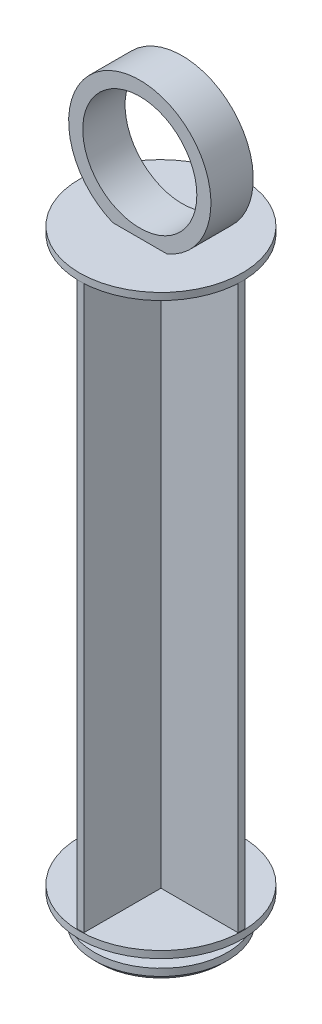
ISO-10303-21;
HEADER;
FILE_DESCRIPTION(('STEP AP214'),'2;1');
FILE_NAME('part.step','',(''),(''),'','','');
FILE_SCHEMA(('AUTOMOTIVE_DESIGN { 1 0 10303 214 1 1 1 1 }'));
ENDSEC;
DATA;
#1=APPLICATION_CONTEXT('core data for automotive mechanical design processes');
#2=APPLICATION_PROTOCOL_DEFINITION('international standard','automotive_design',2000,#1);
#3=PRODUCT_CONTEXT('',#1,'mechanical');
#4=PRODUCT('Part','Part','',(#3));
#5=PRODUCT_RELATED_PRODUCT_CATEGORY('part','',(#4));
#6=PRODUCT_DEFINITION_FORMATION('','',#4);
#7=PRODUCT_DEFINITION_CONTEXT('part definition',#1,'design');
#8=PRODUCT_DEFINITION('design','',#6,#7);
#9=PRODUCT_DEFINITION_SHAPE('','',#8);
#10=(LENGTH_UNIT() NAMED_UNIT(*) SI_UNIT(.MILLI.,.METRE.));
#11=(NAMED_UNIT(*) PLANE_ANGLE_UNIT() SI_UNIT($,.RADIAN.));
#12=(NAMED_UNIT(*) SI_UNIT($,.STERADIAN.) SOLID_ANGLE_UNIT());
#13=UNCERTAINTY_MEASURE_WITH_UNIT(LENGTH_MEASURE(1.E-05),#10,'distance_accuracy_value','');
#14=(GEOMETRIC_REPRESENTATION_CONTEXT(3) GLOBAL_UNCERTAINTY_ASSIGNED_CONTEXT((#13)) GLOBAL_UNIT_ASSIGNED_CONTEXT((#10,
#11,#12)) REPRESENTATION_CONTEXT('',''));
#15=CARTESIAN_POINT('',(0.,0.,0.));
#16=DIRECTION('',(0.,0.,1.));
#17=DIRECTION('',(1.,0.,0.));
#18=AXIS2_PLACEMENT_3D('',#15,#16,#17);
#19=CARTESIAN_POINT('',(0.,61.35,0.));
#20=DIRECTION('',(0.,1.,0.));
#21=DIRECTION('',(0.,0.,1.));
#22=AXIS2_PLACEMENT_3D('',#19,#20,#21);
#23=PLANE('',#22);
#24=CARTESIAN_POINT('',(0.,61.35,0.));
#25=DIRECTION('',(0.,1.,0.));
#26=DIRECTION('',(0.,0.,1.));
#27=AXIS2_PLACEMENT_3D('',#24,#25,#26);
#28=CIRCLE('',#27,17.3);
#29=CARTESIAN_POINT('',(0.,61.35,17.3));
#30=VERTEX_POINT('',#29);
#31=EDGE_CURVE('E160',#30,#30,#28,.T.);
#32=ORIENTED_EDGE('',*,*,#31,.T.);
#33=EDGE_LOOP('',(#32));
#34=FACE_BOUND('',#33,.T.);
#35=DIRECTION('',(1.,0.,0.));
#36=VECTOR('',#35,1.);
#37=CARTESIAN_POINT('',(0.,61.35,-4.5));
#38=LINE('',#37,#36);
#39=CARTESIAN_POINT('',(-5.73732516073476,61.35,-4.5));
#40=VERTEX_POINT('',#39);
#41=CARTESIAN_POINT('',(5.73732516073476,61.35,-4.5));
#42=VERTEX_POINT('',#41);
#43=EDGE_CURVE('E214',#40,#42,#38,.T.);
#44=ORIENTED_EDGE('',*,*,#43,.T.);
#45=DIRECTION('',(0.,0.,-1.));
#46=VECTOR('',#45,1.);
#47=CARTESIAN_POINT('',(5.73732516073476,61.35,4.5));
#48=LINE('',#47,#46);
#49=CARTESIAN_POINT('',(5.73732516073476,61.35,4.5));
#50=VERTEX_POINT('',#49);
#51=EDGE_CURVE('E11',#42,#50,#48,.F.);
#52=ORIENTED_EDGE('',*,*,#51,.T.);
#53=DIRECTION('',(1.,0.,0.));
#54=VECTOR('',#53,1.);
#55=CARTESIAN_POINT('',(0.,61.35,4.5));
#56=LINE('',#55,#54);
#57=CARTESIAN_POINT('',(-5.73732516073476,61.35,4.5));
#58=VERTEX_POINT('',#57);
#59=EDGE_CURVE('E46',#58,#50,#56,.T.);
#60=ORIENTED_EDGE('',*,*,#59,.F.);
#61=DIRECTION('',(0.,0.,-1.));
#62=VECTOR('',#61,1.);
#63=CARTESIAN_POINT('',(-5.73732516073476,61.35,4.5));
#64=LINE('',#63,#62);
#65=EDGE_CURVE('E211',#58,#40,#64,.T.);
#66=ORIENTED_EDGE('',*,*,#65,.T.);
#67=EDGE_LOOP('',(#44,#52,#60,#66));
#68=FACE_BOUND('',#67,.T.);
#69=ADVANCED_FACE('F38',(#34,#68),#23,.T.);
#70=CARTESIAN_POINT('',(0.749999999999997,59.85,-0.75));
#71=DIRECTION('',(-1.,0.,0.));
#72=DIRECTION('',(0.,0.,1.));
#73=AXIS2_PLACEMENT_3D('',#70,#71,#72);
#74=PLANE('',#73);
#75=DIRECTION('',(0.,0.,-1.));
#76=VECTOR('',#75,1.);
#77=CARTESIAN_POINT('',(0.749999999999997,-59.85,-0.75));
#78=LINE('',#77,#76);
#79=CARTESIAN_POINT('',(0.749999999999997,-59.85,-0.75));
#80=VERTEX_POINT('',#79);
#81=CARTESIAN_POINT('',(0.750000000000001,-59.85,-17.15));
#82=VERTEX_POINT('',#81);
#83=EDGE_CURVE('E156',#80,#82,#78,.T.);
#84=ORIENTED_EDGE('',*,*,#83,.T.);
#85=DIRECTION('',(0.,-1.,0.));
#86=VECTOR('',#85,1.);
#87=CARTESIAN_POINT('',(0.750000000000001,59.85,-17.15));
#88=LINE('',#87,#86);
#89=CARTESIAN_POINT('',(0.750000000000001,59.85,-17.15));
#90=VERTEX_POINT('',#89);
#91=EDGE_CURVE('E208',#90,#82,#88,.T.);
#92=ORIENTED_EDGE('',*,*,#91,.F.);
#93=DIRECTION('',(0.,0.,-1.));
#94=VECTOR('',#93,1.);
#95=CARTESIAN_POINT('',(0.749999999999997,59.85,-0.75));
#96=LINE('',#95,#94);
#97=CARTESIAN_POINT('',(0.749999999999997,59.85,-0.75));
#98=VERTEX_POINT('',#97);
#99=EDGE_CURVE('E88',#98,#90,#96,.T.);
#100=ORIENTED_EDGE('',*,*,#99,.F.);
#101=DIRECTION('',(0.,-1.,0.));
#102=VECTOR('',#101,1.);
#103=CARTESIAN_POINT('',(0.749999999999997,59.85,-0.75));
#104=LINE('',#103,#102);
#105=EDGE_CURVE('E155',#98,#80,#104,.T.);
#106=ORIENTED_EDGE('',*,*,#105,.T.);
#107=EDGE_LOOP('',(#84,#92,#100,#106));
#108=FACE_BOUND('',#107,.T.);
#109=ADVANCED_FACE('F40',(#108),#74,.F.);
#110=CARTESIAN_POINT('',(-0.750000000000001,59.85,-17.15));
#111=DIRECTION('',(0.,0.,1.));
#112=DIRECTION('',(1.,0.,0.));
#113=AXIS2_PLACEMENT_3D('',#110,#111,#112);
#114=PLANE('',#113);
#115=DIRECTION('',(-1.,0.,0.));
#116=VECTOR('',#115,1.);
#117=CARTESIAN_POINT('',(-0.750000000000001,-59.85,-17.15));
#118=LINE('',#117,#116);
#119=CARTESIAN_POINT('',(-0.750000000000001,-59.85,-17.15));
#120=VERTEX_POINT('',#119);
#121=EDGE_CURVE('E159',#82,#120,#118,.T.);
#122=ORIENTED_EDGE('',*,*,#121,.T.);
#123=DIRECTION('',(0.,-1.,0.));
#124=VECTOR('',#123,1.);
#125=CARTESIAN_POINT('',(-0.750000000000001,59.85,-17.15));
#126=LINE('',#125,#124);
#127=CARTESIAN_POINT('',(-0.750000000000001,59.85,-17.15));
#128=VERTEX_POINT('',#127);
#129=EDGE_CURVE('E205',#128,#120,#126,.T.);
#130=ORIENTED_EDGE('',*,*,#129,.F.);
#131=DIRECTION('',(-1.,0.,0.));
#132=VECTOR('',#131,1.);
#133=CARTESIAN_POINT('',(-0.750000000000001,59.85,-17.15));
#134=LINE('',#133,#132);
#135=EDGE_CURVE('E255',#90,#128,#134,.T.);
#136=ORIENTED_EDGE('',*,*,#135,.F.);
#137=ORIENTED_EDGE('',*,*,#91,.T.);
#138=EDGE_LOOP('',(#122,#130,#136,#137));
#139=FACE_BOUND('',#138,.T.);
#140=ADVANCED_FACE('F296',(#139),#114,.F.);
#141=CARTESIAN_POINT('',(-0.75,59.85,-0.75));
#142=DIRECTION('',(1.,0.,0.));
#143=DIRECTION('',(0.,0.,-1.));
#144=AXIS2_PLACEMENT_3D('',#141,#142,#143);
#145=PLANE('',#144);
#146=DIRECTION('',(0.,0.,1.));
#147=VECTOR('',#146,1.);
#148=CARTESIAN_POINT('',(-0.75,-59.85,-0.75));
#149=LINE('',#148,#147);
#150=CARTESIAN_POINT('',(-0.75,-59.85,-0.75));
#151=VERTEX_POINT('',#150);
#152=EDGE_CURVE('E76',#120,#151,#149,.T.);
#153=ORIENTED_EDGE('',*,*,#152,.T.);
#154=DIRECTION('',(0.,-1.,0.));
#155=VECTOR('',#154,1.);
#156=CARTESIAN_POINT('',(-0.75,59.85,-0.75));
#157=LINE('',#156,#155);
#158=CARTESIAN_POINT('',(-0.75,59.85,-0.75));
#159=VERTEX_POINT('',#158);
#160=EDGE_CURVE('E202',#159,#151,#157,.T.);
#161=ORIENTED_EDGE('',*,*,#160,.F.);
#162=DIRECTION('',(0.,0.,1.));
#163=VECTOR('',#162,1.);
#164=CARTESIAN_POINT('',(-0.75,59.85,-0.75));
#165=LINE('',#164,#163);
#166=EDGE_CURVE('E258',#128,#159,#165,.T.);
#167=ORIENTED_EDGE('',*,*,#166,.F.);
#168=ORIENTED_EDGE('',*,*,#129,.T.);
#169=EDGE_LOOP('',(#153,#161,#167,#168));
#170=FACE_BOUND('',#169,.T.);
#171=ADVANCED_FACE('F315',(#170),#145,.F.);
#172=CARTESIAN_POINT('',(-0.75,59.85,-0.75));
#173=DIRECTION('',(0.,0.,1.));
#174=DIRECTION('',(1.,0.,0.));
#175=AXIS2_PLACEMENT_3D('',#172,#173,#174);
#176=PLANE('',#175);
#177=DIRECTION('',(-1.,0.,0.));
#178=VECTOR('',#177,1.);
#179=CARTESIAN_POINT('',(-0.75,-59.85,-0.75));
#180=LINE('',#179,#178);
#181=CARTESIAN_POINT('',(-17.15,-59.85,-0.749999999999998));
#182=VERTEX_POINT('',#181);
#183=EDGE_CURVE('E163',#151,#182,#180,.T.);
#184=ORIENTED_EDGE('',*,*,#183,.T.);
#185=DIRECTION('',(0.,-1.,0.));
#186=VECTOR('',#185,1.);
#187=CARTESIAN_POINT('',(-17.15,59.85,-0.749999999999998));
#188=LINE('',#187,#186);
#189=CARTESIAN_POINT('',(-17.15,59.85,-0.749999999999998));
#190=VERTEX_POINT('',#189);
#191=EDGE_CURVE('E199',#190,#182,#188,.T.);
#192=ORIENTED_EDGE('',*,*,#191,.F.);
#193=DIRECTION('',(-1.,0.,0.));
#194=VECTOR('',#193,1.);
#195=CARTESIAN_POINT('',(-0.75,59.85,-0.75));
#196=LINE('',#195,#194);
#197=EDGE_CURVE('E261',#159,#190,#196,.T.);
#198=ORIENTED_EDGE('',*,*,#197,.F.);
#199=ORIENTED_EDGE('',*,*,#160,.T.);
#200=EDGE_LOOP('',(#184,#192,#198,#199));
#201=FACE_BOUND('',#200,.T.);
#202=ADVANCED_FACE('F312',(#201),#176,.F.);
#203=CARTESIAN_POINT('',(-17.15,59.85,0.750000000000002));
#204=DIRECTION('',(1.,0.,0.));
#205=DIRECTION('',(0.,0.,-1.));
#206=AXIS2_PLACEMENT_3D('',#203,#204,#205);
#207=PLANE('',#206);
#208=DIRECTION('',(0.,0.,1.));
#209=VECTOR('',#208,1.);
#210=CARTESIAN_POINT('',(-17.15,-59.85,0.750000000000002));
#211=LINE('',#210,#209);
#212=CARTESIAN_POINT('',(-17.15,-59.85,0.750000000000002));
#213=VERTEX_POINT('',#212);
#214=EDGE_CURVE('E166',#182,#213,#211,.T.);
#215=ORIENTED_EDGE('',*,*,#214,.T.);
#216=DIRECTION('',(0.,-1.,0.));
#217=VECTOR('',#216,1.);
#218=CARTESIAN_POINT('',(-17.15,59.85,0.750000000000002));
#219=LINE('',#218,#217);
#220=CARTESIAN_POINT('',(-17.15,59.85,0.750000000000002));
#221=VERTEX_POINT('',#220);
#222=EDGE_CURVE('E196',#221,#213,#219,.T.);
#223=ORIENTED_EDGE('',*,*,#222,.F.);
#224=DIRECTION('',(0.,0.,1.));
#225=VECTOR('',#224,1.);
#226=CARTESIAN_POINT('',(-17.15,59.85,0.750000000000002));
#227=LINE('',#226,#225);
#228=EDGE_CURVE('E264',#190,#221,#227,.T.);
#229=ORIENTED_EDGE('',*,*,#228,.F.);
#230=ORIENTED_EDGE('',*,*,#191,.T.);
#231=EDGE_LOOP('',(#215,#223,#229,#230));
#232=FACE_BOUND('',#231,.T.);
#233=ADVANCED_FACE('F310',(#232),#207,.F.);
#234=CARTESIAN_POINT('',(-0.750000000000028,59.85,0.75));
#235=DIRECTION('',(0.,0.,-1.));
#236=DIRECTION('',(-1.,0.,0.));
#237=AXIS2_PLACEMENT_3D('',#234,#235,#236);
#238=PLANE('',#237);
#239=DIRECTION('',(1.,0.,0.));
#240=VECTOR('',#239,1.);
#241=CARTESIAN_POINT('',(-0.750000000000028,-59.85,0.75));
#242=LINE('',#241,#240);
#243=CARTESIAN_POINT('',(-0.750000000000028,-59.85,0.75));
#244=VERTEX_POINT('',#243);
#245=EDGE_CURVE('E169',#213,#244,#242,.T.);
#246=ORIENTED_EDGE('',*,*,#245,.T.);
#247=DIRECTION('',(0.,-1.,0.));
#248=VECTOR('',#247,1.);
#249=CARTESIAN_POINT('',(-0.750000000000028,59.85,0.75));
#250=LINE('',#249,#248);
#251=CARTESIAN_POINT('',(-0.750000000000028,59.85,0.75));
#252=VERTEX_POINT('',#251);
#253=EDGE_CURVE('E193',#252,#244,#250,.T.);
#254=ORIENTED_EDGE('',*,*,#253,.F.);
#255=DIRECTION('',(1.,0.,0.));
#256=VECTOR('',#255,1.);
#257=CARTESIAN_POINT('',(-0.750000000000028,59.85,0.75));
#258=LINE('',#257,#256);
#259=EDGE_CURVE('E267',#221,#252,#258,.T.);
#260=ORIENTED_EDGE('',*,*,#259,.F.);
#261=ORIENTED_EDGE('',*,*,#222,.T.);
#262=EDGE_LOOP('',(#246,#254,#260,#261));
#263=FACE_BOUND('',#262,.T.);
#264=ADVANCED_FACE('F307',(#263),#238,.F.);
#265=CARTESIAN_POINT('',(-0.750000000000028,59.85,0.75));
#266=DIRECTION('',(1.,0.,0.));
#267=DIRECTION('',(0.,0.,-1.));
#268=AXIS2_PLACEMENT_3D('',#265,#266,#267);
#269=PLANE('',#268);
#270=DIRECTION('',(0.,0.,1.));
#271=VECTOR('',#270,1.);
#272=CARTESIAN_POINT('',(-0.750000000000028,-59.85,0.75));
#273=LINE('',#272,#271);
#274=CARTESIAN_POINT('',(-0.750000000000028,-59.85,17.15));
#275=VERTEX_POINT('',#274);
#276=EDGE_CURVE('E172',#244,#275,#273,.T.);
#277=ORIENTED_EDGE('',*,*,#276,.T.);
#278=DIRECTION('',(0.,-1.,0.));
#279=VECTOR('',#278,1.);
#280=CARTESIAN_POINT('',(-0.750000000000028,59.85,17.15));
#281=LINE('',#280,#279);
#282=CARTESIAN_POINT('',(-0.750000000000028,59.85,17.15));
#283=VERTEX_POINT('',#282);
#284=EDGE_CURVE('E190',#283,#275,#281,.T.);
#285=ORIENTED_EDGE('',*,*,#284,.F.);
#286=DIRECTION('',(0.,0.,1.));
#287=VECTOR('',#286,1.);
#288=CARTESIAN_POINT('',(-0.750000000000028,59.85,0.75));
#289=LINE('',#288,#287);
#290=EDGE_CURVE('E148',#252,#283,#289,.T.);
#291=ORIENTED_EDGE('',*,*,#290,.F.);
#292=ORIENTED_EDGE('',*,*,#253,.T.);
#293=EDGE_LOOP('',(#277,#285,#291,#292));
#294=FACE_BOUND('',#293,.T.);
#295=ADVANCED_FACE('F272',(#294),#269,.F.);
#296=CARTESIAN_POINT('',(-0.750000000000028,59.85,17.15));
#297=DIRECTION('',(0.,0.,-1.));
#298=DIRECTION('',(-1.,0.,0.));
#299=AXIS2_PLACEMENT_3D('',#296,#297,#298);
#300=PLANE('',#299);
#301=DIRECTION('',(1.,0.,0.));
#302=VECTOR('',#301,1.);
#303=CARTESIAN_POINT('',(-0.750000000000028,-59.85,17.15));
#304=LINE('',#303,#302);
#305=CARTESIAN_POINT('',(0.749999999999973,-59.85,17.15));
#306=VERTEX_POINT('',#305);
#307=EDGE_CURVE('E175',#275,#306,#304,.T.);
#308=ORIENTED_EDGE('',*,*,#307,.T.);
#309=DIRECTION('',(0.,-1.,0.));
#310=VECTOR('',#309,1.);
#311=CARTESIAN_POINT('',(0.749999999999973,59.85,17.15));
#312=LINE('',#311,#310);
#313=CARTESIAN_POINT('',(0.749999999999973,59.85,17.15));
#314=VERTEX_POINT('',#313);
#315=EDGE_CURVE('E131',#314,#306,#312,.T.);
#316=ORIENTED_EDGE('',*,*,#315,.F.);
#317=DIRECTION('',(1.,0.,0.));
#318=VECTOR('',#317,1.);
#319=CARTESIAN_POINT('',(-0.750000000000028,59.85,17.15));
#320=LINE('',#319,#318);
#321=EDGE_CURVE('E146',#283,#314,#320,.T.);
#322=ORIENTED_EDGE('',*,*,#321,.F.);
#323=ORIENTED_EDGE('',*,*,#284,.T.);
#324=EDGE_LOOP('',(#308,#316,#322,#323));
#325=FACE_BOUND('',#324,.T.);
#326=ADVANCED_FACE('F277',(#325),#300,.F.);
#327=CARTESIAN_POINT('',(0.75,59.85,0.75));
#328=DIRECTION('',(-1.,0.,0.));
#329=DIRECTION('',(0.,0.,1.));
#330=AXIS2_PLACEMENT_3D('',#327,#328,#329);
#331=PLANE('',#330);
#332=DIRECTION('',(0.,0.,-1.));
#333=VECTOR('',#332,1.);
#334=CARTESIAN_POINT('',(0.75,-59.85,0.75));
#335=LINE('',#334,#333);
#336=CARTESIAN_POINT('',(0.75,-59.85,0.75));
#337=VERTEX_POINT('',#336);
#338=EDGE_CURVE('E128',#306,#337,#335,.T.);
#339=ORIENTED_EDGE('',*,*,#338,.T.);
#340=DIRECTION('',(0.,-1.,0.));
#341=VECTOR('',#340,1.);
#342=CARTESIAN_POINT('',(0.75,59.85,0.75));
#343=LINE('',#342,#341);
#344=CARTESIAN_POINT('',(0.75,59.85,0.75));
#345=VERTEX_POINT('',#344);
#346=EDGE_CURVE('E119',#345,#337,#343,.T.);
#347=ORIENTED_EDGE('',*,*,#346,.F.);
#348=DIRECTION('',(0.,0.,-1.));
#349=VECTOR('',#348,1.);
#350=CARTESIAN_POINT('',(0.75,59.85,0.75));
#351=LINE('',#350,#349);
#352=EDGE_CURVE('E124',#314,#345,#351,.T.);
#353=ORIENTED_EDGE('',*,*,#352,.F.);
#354=ORIENTED_EDGE('',*,*,#315,.T.);
#355=EDGE_LOOP('',(#339,#347,#353,#354));
#356=FACE_BOUND('',#355,.T.);
#357=ADVANCED_FACE('F121',(#356),#331,.F.);
#358=CARTESIAN_POINT('',(17.15,59.85,0.749999999999998));
#359=DIRECTION('',(0.,0.,-1.));
#360=DIRECTION('',(-1.,0.,0.));
#361=AXIS2_PLACEMENT_3D('',#358,#359,#360);
#362=PLANE('',#361);
#363=DIRECTION('',(1.,0.,0.));
#364=VECTOR('',#363,1.);
#365=CARTESIAN_POINT('',(17.15,-59.85,0.749999999999998));
#366=LINE('',#365,#364);
#367=CARTESIAN_POINT('',(17.15,-59.85,0.749999999999998));
#368=VERTEX_POINT('',#367);
#369=EDGE_CURVE('E179',#337,#368,#366,.T.);
#370=ORIENTED_EDGE('',*,*,#369,.T.);
#371=DIRECTION('',(0.,-1.,0.));
#372=VECTOR('',#371,1.);
#373=CARTESIAN_POINT('',(17.15,59.85,0.749999999999998));
#374=LINE('',#373,#372);
#375=CARTESIAN_POINT('',(17.15,59.85,0.749999999999998));
#376=VERTEX_POINT('',#375);
#377=EDGE_CURVE('E132',#376,#368,#374,.T.);
#378=ORIENTED_EDGE('',*,*,#377,.F.);
#379=DIRECTION('',(1.,0.,0.));
#380=VECTOR('',#379,1.);
#381=CARTESIAN_POINT('',(17.15,59.85,0.749999999999998));
#382=LINE('',#381,#380);
#383=EDGE_CURVE('E135',#345,#376,#382,.T.);
#384=ORIENTED_EDGE('',*,*,#383,.F.);
#385=ORIENTED_EDGE('',*,*,#346,.T.);
#386=EDGE_LOOP('',(#370,#378,#384,#385));
#387=FACE_BOUND('',#386,.T.);
#388=ADVANCED_FACE('F136',(#387),#362,.F.);
#389=CARTESIAN_POINT('',(17.15,59.85,0.749999999999998));
#390=DIRECTION('',(-1.,0.,0.));
#391=DIRECTION('',(0.,0.,1.));
#392=AXIS2_PLACEMENT_3D('',#389,#390,#391);
#393=PLANE('',#392);
#394=DIRECTION('',(0.,0.,-1.));
#395=VECTOR('',#394,1.);
#396=CARTESIAN_POINT('',(17.15,-59.85,0.749999999999998));
#397=LINE('',#396,#395);
#398=CARTESIAN_POINT('',(17.15,-59.85,-0.750000000000002));
#399=VERTEX_POINT('',#398);
#400=EDGE_CURVE('E181',#368,#399,#397,.T.);
#401=ORIENTED_EDGE('',*,*,#400,.T.);
#402=DIRECTION('',(0.,-1.,0.));
#403=VECTOR('',#402,1.);
#404=CARTESIAN_POINT('',(17.15,59.85,-0.750000000000002));
#405=LINE('',#404,#403);
#406=CARTESIAN_POINT('',(17.15,59.85,-0.750000000000002));
#407=VERTEX_POINT('',#406);
#408=EDGE_CURVE('E62',#407,#399,#405,.T.);
#409=ORIENTED_EDGE('',*,*,#408,.F.);
#410=DIRECTION('',(0.,0.,-1.));
#411=VECTOR('',#410,1.);
#412=CARTESIAN_POINT('',(17.15,59.85,0.749999999999998));
#413=LINE('',#412,#411);
#414=EDGE_CURVE('E140',#376,#407,#413,.T.);
#415=ORIENTED_EDGE('',*,*,#414,.F.);
#416=ORIENTED_EDGE('',*,*,#377,.T.);
#417=EDGE_LOOP('',(#401,#409,#415,#416));
#418=FACE_BOUND('',#417,.T.);
#419=ADVANCED_FACE('F292',(#418),#393,.F.);
#420=CARTESIAN_POINT('',(17.15,59.85,-0.750000000000002));
#421=DIRECTION('',(0.,0.,1.));
#422=DIRECTION('',(1.,0.,0.));
#423=AXIS2_PLACEMENT_3D('',#420,#421,#422);
#424=PLANE('',#423);
#425=DIRECTION('',(-1.,0.,0.));
#426=VECTOR('',#425,1.);
#427=CARTESIAN_POINT('',(17.15,-59.85,-0.750000000000002));
#428=LINE('',#427,#426);
#429=EDGE_CURVE('E183',#399,#80,#428,.T.);
#430=ORIENTED_EDGE('',*,*,#429,.T.);
#431=ORIENTED_EDGE('',*,*,#105,.F.);
#432=DIRECTION('',(-1.,0.,0.));
#433=VECTOR('',#432,1.);
#434=CARTESIAN_POINT('',(17.15,59.85,-0.750000000000002));
#435=LINE('',#434,#433);
#436=EDGE_CURVE('E153',#407,#98,#435,.T.);
#437=ORIENTED_EDGE('',*,*,#436,.F.);
#438=ORIENTED_EDGE('',*,*,#408,.T.);
#439=EDGE_LOOP('',(#430,#431,#437,#438));
#440=FACE_BOUND('',#439,.T.);
#441=ADVANCED_FACE('F293',(#440),#424,.F.);
#442=CARTESIAN_POINT('',(0.,59.85,0.));
#443=DIRECTION('',(0.,1.,0.));
#444=DIRECTION('',(0.,0.,1.));
#445=AXIS2_PLACEMENT_3D('',#442,#443,#444);
#446=PLANE('',#445);
#447=CARTESIAN_POINT('',(0.,59.85,0.));
#448=DIRECTION('',(0.,1.,0.));
#449=DIRECTION('',(0.,0.,1.));
#450=AXIS2_PLACEMENT_3D('',#447,#448,#449);
#451=CIRCLE('',#450,17.3);
#452=CARTESIAN_POINT('',(0.,59.85,17.3));
#453=VERTEX_POINT('',#452);
#454=EDGE_CURVE('E247',#453,#453,#451,.T.);
#455=ORIENTED_EDGE('',*,*,#454,.F.);
#456=EDGE_LOOP('',(#455));
#457=FACE_BOUND('',#456,.T.);
#458=ORIENTED_EDGE('',*,*,#436,.T.);
#459=ORIENTED_EDGE('',*,*,#99,.T.);
#460=ORIENTED_EDGE('',*,*,#135,.T.);
#461=ORIENTED_EDGE('',*,*,#166,.T.);
#462=ORIENTED_EDGE('',*,*,#197,.T.);
#463=ORIENTED_EDGE('',*,*,#228,.T.);
#464=ORIENTED_EDGE('',*,*,#259,.T.);
#465=ORIENTED_EDGE('',*,*,#290,.T.);
#466=ORIENTED_EDGE('',*,*,#321,.T.);
#467=ORIENTED_EDGE('',*,*,#352,.T.);
#468=ORIENTED_EDGE('',*,*,#383,.T.);
#469=ORIENTED_EDGE('',*,*,#414,.T.);
#470=EDGE_LOOP('',(#458,#459,#460,#461,#462,#463,#464,#465,#466,#467,#468,#469));
#471=FACE_BOUND('',#470,.T.);
#472=ADVANCED_FACE('F143',(#457,#471),#446,.F.);
#473=CARTESIAN_POINT('',(0.,61.35,0.));
#474=DIRECTION('',(0.,-1.,0.));
#475=DIRECTION('',(0.,0.,-1.));
#476=AXIS2_PLACEMENT_3D('',#473,#474,#475);
#477=CYLINDRICAL_SURFACE('',#476,17.3);
#478=ORIENTED_EDGE('',*,*,#31,.F.);
#479=EDGE_LOOP('',(#478));
#480=FACE_BOUND('',#479,.T.);
#481=ORIENTED_EDGE('',*,*,#454,.T.);
#482=EDGE_LOOP('',(#481));
#483=FACE_BOUND('',#482,.T.);
#484=ADVANCED_FACE('F335',(#480,#483),#477,.T.);
#485=CARTESIAN_POINT('',(0.,-61.35,0.));
#486=DIRECTION('',(0.,1.,0.));
#487=DIRECTION('',(0.,0.,1.));
#488=AXIS2_PLACEMENT_3D('',#485,#486,#487);
#489=CYLINDRICAL_SURFACE('',#488,17.3);
#490=CARTESIAN_POINT('',(0.,-61.35,0.));
#491=DIRECTION('',(0.,1.,0.));
#492=DIRECTION('',(0.,0.,1.));
#493=AXIS2_PLACEMENT_3D('',#490,#491,#492);
#494=CIRCLE('',#493,17.3);
#495=CARTESIAN_POINT('',(0.,-61.35,17.3));
#496=VERTEX_POINT('',#495);
#497=EDGE_CURVE('E244',#496,#496,#494,.T.);
#498=ORIENTED_EDGE('',*,*,#497,.T.);
#499=EDGE_LOOP('',(#498));
#500=FACE_BOUND('',#499,.T.);
#501=CARTESIAN_POINT('',(0.,-59.85,0.));
#502=DIRECTION('',(0.,1.,0.));
#503=DIRECTION('',(0.,0.,1.));
#504=AXIS2_PLACEMENT_3D('',#501,#502,#503);
#505=CIRCLE('',#504,17.3);
#506=CARTESIAN_POINT('',(0.,-59.85,17.3));
#507=VERTEX_POINT('',#506);
#508=EDGE_CURVE('E230',#507,#507,#505,.T.);
#509=ORIENTED_EDGE('',*,*,#508,.F.);
#510=EDGE_LOOP('',(#509));
#511=FACE_BOUND('',#510,.T.);
#512=ADVANCED_FACE('F331',(#500,#511),#489,.T.);
#513=CARTESIAN_POINT('',(0.,-61.35,0.));
#514=DIRECTION('',(0.,-1.,0.));
#515=DIRECTION('',(0.,0.,1.));
#516=AXIS2_PLACEMENT_3D('',#513,#514,#515);
#517=PLANE('',#516);
#518=CARTESIAN_POINT('',(0.,-61.35,0.));
#519=DIRECTION('',(0.,1.,0.));
#520=DIRECTION('',(0.,0.,1.));
#521=AXIS2_PLACEMENT_3D('',#518,#519,#520);
#522=CIRCLE('',#521,5.95);
#523=CARTESIAN_POINT('',(0.,-61.35,5.95));
#524=VERTEX_POINT('',#523);
#525=EDGE_CURVE('E564',#524,#524,#522,.T.);
#526=ORIENTED_EDGE('',*,*,#525,.T.);
#527=EDGE_LOOP('',(#526));
#528=FACE_BOUND('',#527,.T.);
#529=ORIENTED_EDGE('',*,*,#497,.F.);
#530=EDGE_LOOP('',(#529));
#531=FACE_BOUND('',#530,.T.);
#532=ADVANCED_FACE('F402',(#528,#531),#517,.T.);
#533=CARTESIAN_POINT('',(0.,-59.85,0.));
#534=DIRECTION('',(0.,-1.,0.));
#535=DIRECTION('',(0.,0.,1.));
#536=AXIS2_PLACEMENT_3D('',#533,#534,#535);
#537=PLANE('',#536);
#538=ORIENTED_EDGE('',*,*,#83,.F.);
#539=ORIENTED_EDGE('',*,*,#429,.F.);
#540=ORIENTED_EDGE('',*,*,#400,.F.);
#541=ORIENTED_EDGE('',*,*,#369,.F.);
#542=ORIENTED_EDGE('',*,*,#338,.F.);
#543=ORIENTED_EDGE('',*,*,#307,.F.);
#544=ORIENTED_EDGE('',*,*,#276,.F.);
#545=ORIENTED_EDGE('',*,*,#245,.F.);
#546=ORIENTED_EDGE('',*,*,#214,.F.);
#547=ORIENTED_EDGE('',*,*,#183,.F.);
#548=ORIENTED_EDGE('',*,*,#152,.F.);
#549=ORIENTED_EDGE('',*,*,#121,.F.);
#550=EDGE_LOOP('',(#538,#539,#540,#541,#542,#543,#544,#545,#546,#547,#548,#549));
#551=FACE_BOUND('',#550,.T.);
#552=ORIENTED_EDGE('',*,*,#508,.T.);
#553=EDGE_LOOP('',(#552));
#554=FACE_BOUND('',#553,.T.);
#555=ADVANCED_FACE('F289',(#551,#554),#537,.F.);
#556=CARTESIAN_POINT('',(0.,75.35,4.5));
#557=DIRECTION('',(0.,0.,1.));
#558=DIRECTION('',(1.,0.,0.));
#559=AXIS2_PLACEMENT_3D('',#556,#557,#558);
#560=PLANE('',#559);
#561=CARTESIAN_POINT('',(0.,75.35,4.5));
#562=DIRECTION('',(0.,0.,1.));
#563=DIRECTION('',(1.,0.,0.));
#564=AXIS2_PLACEMENT_3D('',#561,#562,#563);
#565=CIRCLE('',#564,15.13);
#566=EDGE_CURVE('E225',#50,#58,#565,.T.);
#567=ORIENTED_EDGE('',*,*,#566,.T.);
#568=ORIENTED_EDGE('',*,*,#59,.T.);
#569=EDGE_LOOP('',(#567,#568));
#570=FACE_BOUND('',#569,.T.);
#571=CARTESIAN_POINT('',(0.,75.35,4.5));
#572=DIRECTION('',(0.,0.,1.));
#573=DIRECTION('',(1.,0.,0.));
#574=AXIS2_PLACEMENT_3D('',#571,#572,#573);
#575=CIRCLE('',#574,12.13);
#576=CARTESIAN_POINT('',(12.13,75.35,4.5));
#577=VERTEX_POINT('',#576);
#578=EDGE_CURVE('E237',#577,#577,#575,.T.);
#579=ORIENTED_EDGE('',*,*,#578,.F.);
#580=EDGE_LOOP('',(#579));
#581=FACE_BOUND('',#580,.T.);
#582=ADVANCED_FACE('F222',(#570,#581),#560,.T.);
#583=CARTESIAN_POINT('',(0.,75.35,-4.5));
#584=DIRECTION('',(0.,0.,1.));
#585=DIRECTION('',(1.,0.,0.));
#586=AXIS2_PLACEMENT_3D('',#583,#584,#585);
#587=PLANE('',#586);
#588=ORIENTED_EDGE('',*,*,#43,.F.);
#589=CARTESIAN_POINT('',(0.,75.35,-4.5));
#590=DIRECTION('',(0.,0.,1.));
#591=DIRECTION('',(1.,0.,0.));
#592=AXIS2_PLACEMENT_3D('',#589,#590,#591);
#593=CIRCLE('',#592,15.13);
#594=EDGE_CURVE('E53',#42,#40,#593,.T.);
#595=ORIENTED_EDGE('',*,*,#594,.F.);
#596=EDGE_LOOP('',(#588,#595));
#597=FACE_BOUND('',#596,.T.);
#598=CARTESIAN_POINT('',(0.,75.35,-4.5));
#599=DIRECTION('',(0.,0.,1.));
#600=DIRECTION('',(1.,0.,0.));
#601=AXIS2_PLACEMENT_3D('',#598,#599,#600);
#602=CIRCLE('',#601,12.13);
#603=CARTESIAN_POINT('',(12.13,75.35,-4.5));
#604=VERTEX_POINT('',#603);
#605=EDGE_CURVE('E240',#604,#604,#602,.T.);
#606=ORIENTED_EDGE('',*,*,#605,.T.);
#607=EDGE_LOOP('',(#606));
#608=FACE_BOUND('',#607,.T.);
#609=ADVANCED_FACE('F235',(#597,#608),#587,.F.);
#610=CARTESIAN_POINT('',(0.,75.35,4.5));
#611=DIRECTION('',(0.,0.,-1.));
#612=DIRECTION('',(-1.,0.,0.));
#613=AXIS2_PLACEMENT_3D('',#610,#611,#612);
#614=CYLINDRICAL_SURFACE('',#613,15.13);
#615=ORIENTED_EDGE('',*,*,#51,.F.);
#616=ORIENTED_EDGE('',*,*,#594,.T.);
#617=ORIENTED_EDGE('',*,*,#65,.F.);
#618=ORIENTED_EDGE('',*,*,#566,.F.);
#619=EDGE_LOOP('',(#615,#616,#617,#618));
#620=FACE_BOUND('',#619,.T.);
#621=ADVANCED_FACE('F229',(#620),#614,.T.);
#622=CARTESIAN_POINT('',(0.,75.35,4.5));
#623=DIRECTION('',(0.,0.,-1.));
#624=DIRECTION('',(-1.,0.,0.));
#625=AXIS2_PLACEMENT_3D('',#622,#623,#624);
#626=CYLINDRICAL_SURFACE('',#625,12.13);
#627=ORIENTED_EDGE('',*,*,#578,.T.);
#628=EDGE_LOOP('',(#627));
#629=FACE_BOUND('',#628,.T.);
#630=ORIENTED_EDGE('',*,*,#605,.F.);
#631=EDGE_LOOP('',(#630));
#632=FACE_BOUND('',#631,.T.);
#633=ADVANCED_FACE('F435',(#629,#632),#626,.F.);
#634=CARTESIAN_POINT('',(0.,-54.3738594537499,0.));
#635=DIRECTION('',(0.,1.,0.));
#636=DIRECTION('',(0.,0.,1.));
#637=AXIS2_PLACEMENT_3D('',#634,#635,#636);
#638=CYLINDRICAL_SURFACE('',#637,5.95);
#639=CARTESIAN_POINT('',(0.,-65.35,0.));
#640=DIRECTION('',(0.,1.,0.));
#641=DIRECTION('',(0.,0.,1.));
#642=AXIS2_PLACEMENT_3D('',#639,#640,#641);
#643=CIRCLE('',#642,5.95);
#644=CARTESIAN_POINT('',(0.,-65.35,5.95));
#645=VERTEX_POINT('',#644);
#646=EDGE_CURVE('E561',#645,#645,#643,.T.);
#647=ORIENTED_EDGE('',*,*,#646,.T.);
#648=EDGE_LOOP('',(#647));
#649=FACE_BOUND('',#648,.T.);
#650=ORIENTED_EDGE('',*,*,#525,.F.);
#651=EDGE_LOOP('',(#650));
#652=FACE_BOUND('',#651,.T.);
#653=ADVANCED_FACE('F441',(#649,#652),#638,.T.);
#654=CARTESIAN_POINT('',(0.,-65.35,5.95));
#655=DIRECTION('',(0.,1.,0.));
#656=DIRECTION('',(0.,0.,1.));
#657=AXIS2_PLACEMENT_3D('',#654,#655,#656);
#658=PLANE('',#657);
#659=CARTESIAN_POINT('',(0.,-65.35,0.));
#660=DIRECTION('',(0.,1.,0.));
#661=DIRECTION('',(0.,0.,1.));
#662=AXIS2_PLACEMENT_3D('',#659,#660,#661);
#663=CIRCLE('',#662,14.15);
#664=CARTESIAN_POINT('',(0.,-65.35,14.15));
#665=VERTEX_POINT('',#664);
#666=EDGE_CURVE('E556',#665,#665,#663,.T.);
#667=ORIENTED_EDGE('',*,*,#666,.T.);
#668=EDGE_LOOP('',(#667));
#669=FACE_BOUND('',#668,.T.);
#670=ORIENTED_EDGE('',*,*,#646,.F.);
#671=EDGE_LOOP('',(#670));
#672=FACE_BOUND('',#671,.T.);
#673=ADVANCED_FACE('F448',(#669,#672),#658,.T.);
#674=CARTESIAN_POINT('',(0.,-54.3738594537499,0.));
#675=DIRECTION('',(0.,1.,0.));
#676=DIRECTION('',(0.,0.,1.));
#677=AXIS2_PLACEMENT_3D('',#674,#675,#676);
#678=CYLINDRICAL_SURFACE('',#677,14.15);
#679=CARTESIAN_POINT('',(0.,-66.85,0.));
#680=DIRECTION('',(0.,1.,0.));
#681=DIRECTION('',(0.,0.,1.));
#682=AXIS2_PLACEMENT_3D('',#679,#680,#681);
#683=CIRCLE('',#682,14.15);
#684=CARTESIAN_POINT('',(0.,-66.85,14.15));
#685=VERTEX_POINT('',#684);
#686=EDGE_CURVE('E553',#685,#685,#683,.T.);
#687=ORIENTED_EDGE('',*,*,#686,.T.);
#688=EDGE_LOOP('',(#687));
#689=FACE_BOUND('',#688,.T.);
#690=ORIENTED_EDGE('',*,*,#666,.F.);
#691=EDGE_LOOP('',(#690));
#692=FACE_BOUND('',#691,.T.);
#693=ADVANCED_FACE('F456',(#689,#692),#678,.T.);
#694=CARTESIAN_POINT('',(0.,-66.85,0.));
#695=DIRECTION('',(0.,1.,0.));
#696=DIRECTION('',(0.,0.,1.));
#697=AXIS2_PLACEMENT_3D('',#694,#695,#696);
#698=CONICAL_SURFACE('',#697,14.15,0.785398163397449);
#699=CARTESIAN_POINT('',(0.,-67.85,0.));
#700=DIRECTION('',(0.,1.,0.));
#701=DIRECTION('',(0.,0.,1.));
#702=AXIS2_PLACEMENT_3D('',#699,#700,#701);
#703=CIRCLE('',#702,13.15);
#704=CARTESIAN_POINT('',(0.,-67.85,13.15));
#705=VERTEX_POINT('',#704);
#706=EDGE_CURVE('E552',#705,#705,#703,.T.);
#707=ORIENTED_EDGE('',*,*,#706,.T.);
#708=EDGE_LOOP('',(#707));
#709=FACE_BOUND('',#708,.T.);
#710=ORIENTED_EDGE('',*,*,#686,.F.);
#711=EDGE_LOOP('',(#710));
#712=FACE_BOUND('',#711,.T.);
#713=ADVANCED_FACE('F464',(#709,#712),#698,.T.);
#714=CARTESIAN_POINT('',(0.,-67.85,13.15));
#715=DIRECTION('',(0.,-1.,0.));
#716=DIRECTION('',(0.,0.,-1.));
#717=AXIS2_PLACEMENT_3D('',#714,#715,#716);
#718=PLANE('',#717);
#719=ORIENTED_EDGE('',*,*,#706,.F.);
#720=EDGE_LOOP('',(#719));
#721=FACE_BOUND('',#720,.T.);
#722=ADVANCED_FACE('F472',(#721),#718,.T.);
#723=CLOSED_SHELL('',(#69,#109,#140,#171,#202,#233,#264,#295,#326,#357,#388,#419,#441,#472,#484,
#512,#532,#555,#582,#609,#621,#633,#653,#673,#693,#713,#722));
#724=MANIFOLD_SOLID_BREP('B2',#723);
#725=ADVANCED_BREP_SHAPE_REPRESENTATION('',(#18,#724),#14);
#726=SHAPE_DEFINITION_REPRESENTATION(#9,#725);
ENDSEC;
END-ISO-10303-21;
